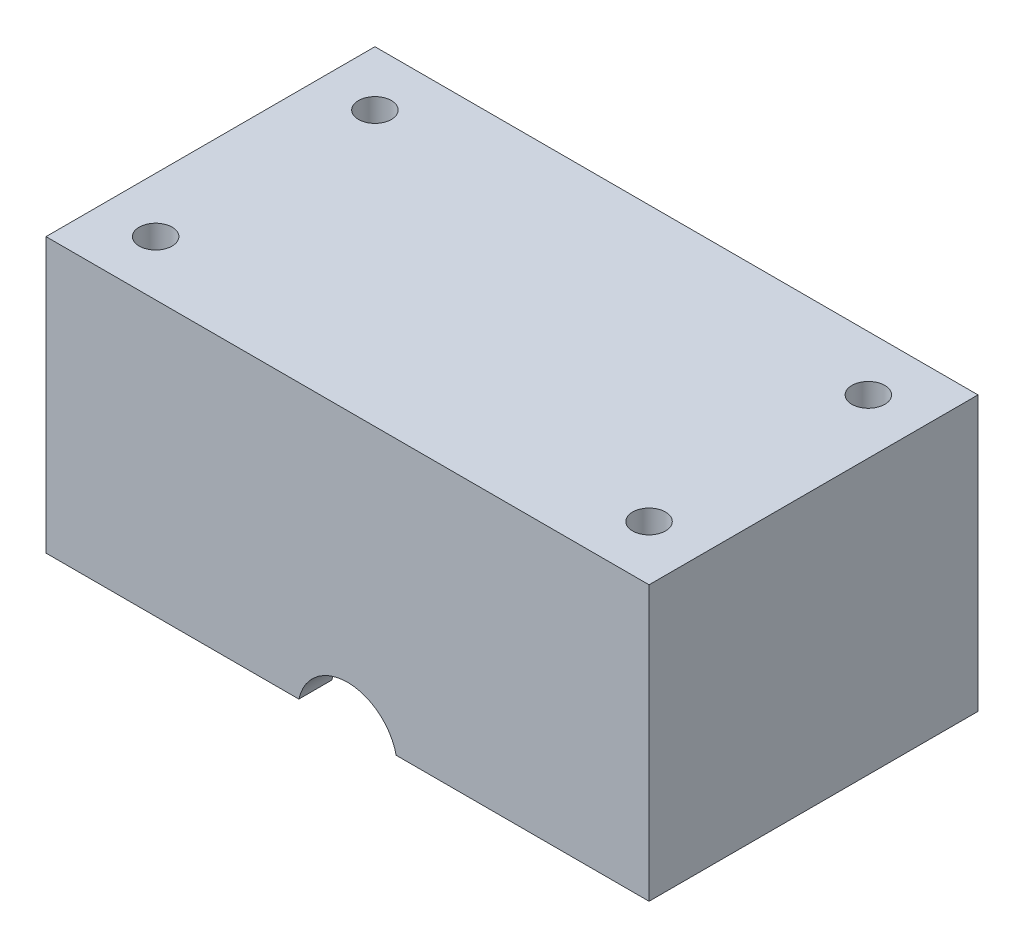
ISO-10303-21;
HEADER;
FILE_DESCRIPTION(('STEP AP214'),'2;1');
FILE_NAME('part.step','',(''),(''),'','','');
FILE_SCHEMA(('AUTOMOTIVE_DESIGN { 1 0 10303 214 1 1 1 1 }'));
ENDSEC;
DATA;
#1=APPLICATION_CONTEXT('core data for automotive mechanical design processes');
#2=APPLICATION_PROTOCOL_DEFINITION('international standard','automotive_design',2000,#1);
#3=PRODUCT_CONTEXT('',#1,'mechanical');
#4=PRODUCT('Part','Part','',(#3));
#5=PRODUCT_RELATED_PRODUCT_CATEGORY('part','',(#4));
#6=PRODUCT_DEFINITION_FORMATION('','',#4);
#7=PRODUCT_DEFINITION_CONTEXT('part definition',#1,'design');
#8=PRODUCT_DEFINITION('design','',#6,#7);
#9=PRODUCT_DEFINITION_SHAPE('','',#8);
#10=(LENGTH_UNIT() NAMED_UNIT(*) SI_UNIT(.MILLI.,.METRE.));
#11=(NAMED_UNIT(*) PLANE_ANGLE_UNIT() SI_UNIT($,.RADIAN.));
#12=(NAMED_UNIT(*) SI_UNIT($,.STERADIAN.) SOLID_ANGLE_UNIT());
#13=UNCERTAINTY_MEASURE_WITH_UNIT(LENGTH_MEASURE(1.E-05),#10,'distance_accuracy_value','');
#14=(GEOMETRIC_REPRESENTATION_CONTEXT(3) GLOBAL_UNCERTAINTY_ASSIGNED_CONTEXT((#13)) GLOBAL_UNIT_ASSIGNED_CONTEXT((#10,
#11,#12)) REPRESENTATION_CONTEXT('',''));
#15=CARTESIAN_POINT('',(0.,0.,0.));
#16=DIRECTION('',(0.,0.,1.));
#17=DIRECTION('',(1.,0.,0.));
#18=AXIS2_PLACEMENT_3D('',#15,#16,#17);
#19=CARTESIAN_POINT('',(0.,0.,10.));
#20=DIRECTION('',(0.,0.,-1.));
#21=DIRECTION('',(-1.,0.,0.));
#22=AXIS2_PLACEMENT_3D('',#19,#20,#21);
#23=CYLINDRICAL_SURFACE('',#22,15.);
#24=CARTESIAN_POINT('',(0.,0.,7.));
#25=DIRECTION('',(0.,0.,1.));
#26=DIRECTION('',(1.,0.,0.));
#27=AXIS2_PLACEMENT_3D('',#24,#25,#26);
#28=CIRCLE('',#27,15.);
#29=CARTESIAN_POINT('',(14.9666295470958,0.999999999999997,7.));
#30=VERTEX_POINT('',#29);
#31=CARTESIAN_POINT('',(-14.9666295470958,0.999999999999997,7.));
#32=VERTEX_POINT('',#31);
#33=EDGE_CURVE('E204',#30,#32,#28,.T.);
#34=ORIENTED_EDGE('',*,*,#33,.T.);
#35=DIRECTION('',(0.,0.,-1.));
#36=VECTOR('',#35,1.);
#37=CARTESIAN_POINT('',(-14.9666295470958,0.999999999999997,10.));
#38=LINE('',#37,#36);
#39=CARTESIAN_POINT('',(-14.9666295470958,0.999999999999997,-3.));
#40=VERTEX_POINT('',#39);
#41=EDGE_CURVE('E289',#32,#40,#38,.T.);
#42=ORIENTED_EDGE('',*,*,#41,.T.);
#43=CARTESIAN_POINT('',(0.,0.,-3.));
#44=DIRECTION('',(0.,0.,1.));
#45=DIRECTION('',(1.,0.,0.));
#46=AXIS2_PLACEMENT_3D('',#43,#44,#45);
#47=CIRCLE('',#46,15.);
#48=CARTESIAN_POINT('',(14.9666295470958,0.999999999999997,-3.));
#49=VERTEX_POINT('',#48);
#50=EDGE_CURVE('E200',#49,#40,#47,.T.);
#51=ORIENTED_EDGE('',*,*,#50,.F.);
#52=DIRECTION('',(0.,0.,-1.));
#53=VECTOR('',#52,1.);
#54=CARTESIAN_POINT('',(14.9666295470958,0.999999999999997,10.));
#55=LINE('',#54,#53);
#56=EDGE_CURVE('E319',#49,#30,#55,.F.);
#57=ORIENTED_EDGE('',*,*,#56,.T.);
#58=EDGE_LOOP('',(#34,#42,#51,#57));
#59=FACE_BOUND('',#58,.T.);
#60=ADVANCED_FACE('F70',(#59),#23,.F.);
#61=CARTESIAN_POINT('',(0.,0.,-20.));
#62=DIRECTION('',(0.,0.,1.));
#63=DIRECTION('',(1.,0.,0.));
#64=AXIS2_PLACEMENT_3D('',#61,#62,#63);
#65=CYLINDRICAL_SURFACE('',#64,15.);
#66=CARTESIAN_POINT('',(0.,0.,-17.));
#67=DIRECTION('',(0.,0.,-1.));
#68=DIRECTION('',(-1.,0.,0.));
#69=AXIS2_PLACEMENT_3D('',#66,#67,#68);
#70=CIRCLE('',#69,15.);
#71=CARTESIAN_POINT('',(-14.9666295470958,0.999999999999997,-17.));
#72=VERTEX_POINT('',#71);
#73=CARTESIAN_POINT('',(14.9666295470958,0.999999999999997,-17.));
#74=VERTEX_POINT('',#73);
#75=EDGE_CURVE('E213',#72,#74,#70,.T.);
#76=ORIENTED_EDGE('',*,*,#75,.T.);
#77=DIRECTION('',(0.,0.,1.));
#78=VECTOR('',#77,1.);
#79=CARTESIAN_POINT('',(14.9666295470958,0.999999999999997,-20.));
#80=LINE('',#79,#78);
#81=CARTESIAN_POINT('',(14.9666295470958,0.999999999999997,-7.));
#82=VERTEX_POINT('',#81);
#83=EDGE_CURVE('E313',#74,#82,#80,.T.);
#84=ORIENTED_EDGE('',*,*,#83,.T.);
#85=CARTESIAN_POINT('',(0.,0.,-7.));
#86=DIRECTION('',(0.,0.,-1.));
#87=DIRECTION('',(-1.,0.,0.));
#88=AXIS2_PLACEMENT_3D('',#85,#86,#87);
#89=CIRCLE('',#88,15.);
#90=CARTESIAN_POINT('',(-14.9666295470958,0.999999999999997,-7.));
#91=VERTEX_POINT('',#90);
#92=EDGE_CURVE('E196',#91,#82,#89,.T.);
#93=ORIENTED_EDGE('',*,*,#92,.F.);
#94=DIRECTION('',(0.,0.,1.));
#95=VECTOR('',#94,1.);
#96=CARTESIAN_POINT('',(-14.9666295470958,0.999999999999997,-20.));
#97=LINE('',#96,#95);
#98=EDGE_CURVE('E305',#91,#72,#97,.F.);
#99=ORIENTED_EDGE('',*,*,#98,.T.);
#100=EDGE_LOOP('',(#76,#84,#93,#99));
#101=FACE_BOUND('',#100,.T.);
#102=ADVANCED_FACE('F348',(#101),#65,.F.);
#103=CARTESIAN_POINT('',(0.,0.,-20.));
#104=DIRECTION('',(0.,0.,1.));
#105=DIRECTION('',(1.,0.,0.));
#106=AXIS2_PLACEMENT_3D('',#103,#104,#105);
#107=CYLINDRICAL_SURFACE('',#106,4.55);
#108=DIRECTION('',(0.,0.,1.));
#109=VECTOR('',#108,1.);
#110=CARTESIAN_POINT('',(4.43874982399324,0.999999999999997,-20.));
#111=LINE('',#110,#109);
#112=CARTESIAN_POINT('',(4.43874982399324,0.999999999999997,-3.));
#113=VERTEX_POINT('',#112);
#114=CARTESIAN_POINT('',(4.43874982399324,0.999999999999997,-7.));
#115=VERTEX_POINT('',#114);
#116=EDGE_CURVE('E317',#113,#115,#111,.F.);
#117=ORIENTED_EDGE('',*,*,#116,.F.);
#118=CARTESIAN_POINT('',(0.,0.,-3.));
#119=DIRECTION('',(0.,0.,1.));
#120=DIRECTION('',(1.,0.,0.));
#121=AXIS2_PLACEMENT_3D('',#118,#119,#120);
#122=CIRCLE('',#121,4.55);
#123=CARTESIAN_POINT('',(-4.43874982399324,0.999999999999997,-3.));
#124=VERTEX_POINT('',#123);
#125=EDGE_CURVE('E197',#124,#113,#122,.F.);
#126=ORIENTED_EDGE('',*,*,#125,.F.);
#127=DIRECTION('',(0.,0.,1.));
#128=VECTOR('',#127,1.);
#129=CARTESIAN_POINT('',(-4.43874982399324,0.999999999999997,-20.));
#130=LINE('',#129,#128);
#131=CARTESIAN_POINT('',(-4.43874982399324,0.999999999999997,-7.));
#132=VERTEX_POINT('',#131);
#133=EDGE_CURVE('E297',#132,#124,#130,.T.);
#134=ORIENTED_EDGE('',*,*,#133,.F.);
#135=CARTESIAN_POINT('',(0.,0.,-7.));
#136=DIRECTION('',(0.,0.,-1.));
#137=DIRECTION('',(-1.,0.,0.));
#138=AXIS2_PLACEMENT_3D('',#135,#136,#137);
#139=CIRCLE('',#138,4.55);
#140=EDGE_CURVE('E191',#115,#132,#139,.F.);
#141=ORIENTED_EDGE('',*,*,#140,.F.);
#142=EDGE_LOOP('',(#117,#126,#134,#141));
#143=FACE_BOUND('',#142,.T.);
#144=ADVANCED_FACE('F354',(#143),#107,.F.);
#145=CARTESIAN_POINT('',(0.,0.,-7.));
#146=DIRECTION('',(0.,0.,-1.));
#147=DIRECTION('',(-1.,0.,0.));
#148=AXIS2_PLACEMENT_3D('',#145,#146,#147);
#149=PLANE('',#148);
#150=ORIENTED_EDGE('',*,*,#92,.T.);
#151=DIRECTION('',(-1.,0.,0.));
#152=VECTOR('',#151,1.);
#153=CARTESIAN_POINT('',(0.,0.999999999999997,-7.));
#154=LINE('',#153,#152);
#155=EDGE_CURVE('E306',#82,#115,#154,.T.);
#156=ORIENTED_EDGE('',*,*,#155,.T.);
#157=ORIENTED_EDGE('',*,*,#140,.T.);
#158=EDGE_CURVE('E301',#132,#91,#154,.T.);
#159=ORIENTED_EDGE('',*,*,#158,.T.);
#160=EDGE_LOOP('',(#150,#156,#157,#159));
#161=FACE_BOUND('',#160,.T.);
#162=ADVANCED_FACE('F391',(#161),#149,.T.);
#163=CARTESIAN_POINT('',(0.,0.,-3.));
#164=DIRECTION('',(0.,0.,1.));
#165=DIRECTION('',(1.,0.,0.));
#166=AXIS2_PLACEMENT_3D('',#163,#164,#165);
#167=PLANE('',#166);
#168=ORIENTED_EDGE('',*,*,#50,.T.);
#169=DIRECTION('',(1.,0.,0.));
#170=VECTOR('',#169,1.);
#171=CARTESIAN_POINT('',(0.,0.999999999999997,-3.));
#172=LINE('',#171,#170);
#173=EDGE_CURVE('E293',#40,#124,#172,.T.);
#174=ORIENTED_EDGE('',*,*,#173,.T.);
#175=ORIENTED_EDGE('',*,*,#125,.T.);
#176=EDGE_CURVE('E298',#113,#49,#172,.T.);
#177=ORIENTED_EDGE('',*,*,#176,.T.);
#178=EDGE_LOOP('',(#168,#174,#175,#177));
#179=FACE_BOUND('',#178,.T.);
#180=ADVANCED_FACE('F329',(#179),#167,.T.);
#181=CARTESIAN_POINT('',(0.,0.,-17.));
#182=DIRECTION('',(0.,0.,-1.));
#183=DIRECTION('',(-1.,0.,0.));
#184=AXIS2_PLACEMENT_3D('',#181,#182,#183);
#185=PLANE('',#184);
#186=DIRECTION('',(-1.,0.,0.));
#187=VECTOR('',#186,1.);
#188=CARTESIAN_POINT('',(0.,0.999999999999997,-17.));
#189=LINE('',#188,#187);
#190=EDGE_CURVE('E310',#74,#72,#189,.T.);
#191=ORIENTED_EDGE('',*,*,#190,.F.);
#192=ORIENTED_EDGE('',*,*,#75,.F.);
#193=EDGE_LOOP('',(#191,#192));
#194=FACE_BOUND('',#193,.T.);
#195=ADVANCED_FACE('F344',(#194),#185,.F.);
#196=CARTESIAN_POINT('',(0.,0.,7.));
#197=DIRECTION('',(0.,0.,1.));
#198=DIRECTION('',(1.,0.,0.));
#199=AXIS2_PLACEMENT_3D('',#196,#197,#198);
#200=PLANE('',#199);
#201=DIRECTION('',(1.,0.,0.));
#202=VECTOR('',#201,1.);
#203=CARTESIAN_POINT('',(0.,0.999999999999997,7.));
#204=LINE('',#203,#202);
#205=CARTESIAN_POINT('',(-4.43874982399324,0.999999999999997,7.));
#206=VERTEX_POINT('',#205);
#207=EDGE_CURVE('E286',#32,#206,#204,.T.);
#208=ORIENTED_EDGE('',*,*,#207,.F.);
#209=ORIENTED_EDGE('',*,*,#33,.F.);
#210=CARTESIAN_POINT('',(4.43874982399324,0.999999999999997,7.));
#211=VERTEX_POINT('',#210);
#212=EDGE_CURVE('E220',#211,#30,#204,.T.);
#213=ORIENTED_EDGE('',*,*,#212,.F.);
#214=CARTESIAN_POINT('',(0.,0.,7.));
#215=DIRECTION('',(0.,0.,1.));
#216=DIRECTION('',(1.,0.,0.));
#217=AXIS2_PLACEMENT_3D('',#214,#215,#216);
#218=CIRCLE('',#217,4.55);
#219=EDGE_CURVE('E201',#211,#206,#218,.T.);
#220=ORIENTED_EDGE('',*,*,#219,.T.);
#221=EDGE_LOOP('',(#208,#209,#213,#220));
#222=FACE_BOUND('',#221,.T.);
#223=ADVANCED_FACE('F332',(#222),#200,.F.);
#224=CARTESIAN_POINT('',(0.,0.,-10.));
#225=DIRECTION('',(0.,0.,1.));
#226=DIRECTION('',(1.,0.,0.));
#227=AXIS2_PLACEMENT_3D('',#224,#225,#226);
#228=CYLINDRICAL_SURFACE('',#227,4.55);
#229=DIRECTION('',(0.,0.,1.));
#230=VECTOR('',#229,1.);
#231=CARTESIAN_POINT('',(4.43874982399324,0.999999999999997,-10.));
#232=LINE('',#231,#230);
#233=CARTESIAN_POINT('',(4.43874982399324,0.999999999999997,10.));
#234=VERTEX_POINT('',#233);
#235=EDGE_CURVE('E215',#234,#211,#232,.F.);
#236=ORIENTED_EDGE('',*,*,#235,.F.);
#237=CARTESIAN_POINT('',(0.,0.,10.));
#238=DIRECTION('',(0.,0.,1.));
#239=DIRECTION('',(1.,0.,0.));
#240=AXIS2_PLACEMENT_3D('',#237,#238,#239);
#241=CIRCLE('',#240,4.55);
#242=CARTESIAN_POINT('',(-4.43874982399324,0.999999999999997,10.));
#243=VERTEX_POINT('',#242);
#244=EDGE_CURVE('E205',#234,#243,#241,.T.);
#245=ORIENTED_EDGE('',*,*,#244,.T.);
#246=DIRECTION('',(0.,0.,1.));
#247=VECTOR('',#246,1.);
#248=CARTESIAN_POINT('',(-4.43874982399324,0.999999999999997,-10.));
#249=LINE('',#248,#247);
#250=EDGE_CURVE('E164',#206,#243,#249,.T.);
#251=ORIENTED_EDGE('',*,*,#250,.F.);
#252=ORIENTED_EDGE('',*,*,#219,.F.);
#253=EDGE_LOOP('',(#236,#245,#251,#252));
#254=FACE_BOUND('',#253,.T.);
#255=ADVANCED_FACE('F333',(#254),#228,.F.);
#256=CARTESIAN_POINT('',(-22.5,-17.5,-15.));
#257=DIRECTION('',(0.,1.,0.));
#258=DIRECTION('',(0.,0.,1.));
#259=AXIS2_PLACEMENT_3D('',#256,#257,#258);
#260=CYLINDRICAL_SURFACE('',#259,1.5);
#261=CARTESIAN_POINT('',(-22.5,26.,-15.));
#262=DIRECTION('',(0.,1.,0.));
#263=DIRECTION('',(0.,0.,1.));
#264=AXIS2_PLACEMENT_3D('',#261,#262,#263);
#265=CIRCLE('',#264,1.5);
#266=CARTESIAN_POINT('',(-22.5,26.,-13.5));
#267=VERTEX_POINT('',#266);
#268=EDGE_CURVE('E241',#267,#267,#265,.T.);
#269=ORIENTED_EDGE('',*,*,#268,.T.);
#270=EDGE_LOOP('',(#269));
#271=FACE_BOUND('',#270,.T.);
#272=CARTESIAN_POINT('',(-22.5,0.999999999999997,-15.));
#273=DIRECTION('',(0.,-1.,0.));
#274=DIRECTION('',(0.,0.,-1.));
#275=AXIS2_PLACEMENT_3D('',#272,#273,#274);
#276=CIRCLE('',#275,1.5);
#277=CARTESIAN_POINT('',(-22.5,0.999999999999997,-16.5));
#278=VERTEX_POINT('',#277);
#279=EDGE_CURVE('E280',#278,#278,#276,.F.);
#280=ORIENTED_EDGE('',*,*,#279,.F.);
#281=EDGE_LOOP('',(#280));
#282=FACE_BOUND('',#281,.T.);
#283=ADVANCED_FACE('F335',(#271,#282),#260,.F.);
#284=CARTESIAN_POINT('',(-22.5,-17.5,5.));
#285=DIRECTION('',(0.,1.,0.));
#286=DIRECTION('',(0.,0.,1.));
#287=AXIS2_PLACEMENT_3D('',#284,#285,#286);
#288=CYLINDRICAL_SURFACE('',#287,1.5);
#289=CARTESIAN_POINT('',(-22.5,26.,5.));
#290=DIRECTION('',(0.,1.,0.));
#291=DIRECTION('',(0.,0.,1.));
#292=AXIS2_PLACEMENT_3D('',#289,#290,#291);
#293=CIRCLE('',#292,1.5);
#294=CARTESIAN_POINT('',(-22.5,26.,6.5));
#295=VERTEX_POINT('',#294);
#296=EDGE_CURVE('E237',#295,#295,#293,.T.);
#297=ORIENTED_EDGE('',*,*,#296,.T.);
#298=EDGE_LOOP('',(#297));
#299=FACE_BOUND('',#298,.T.);
#300=CARTESIAN_POINT('',(-22.5,0.999999999999997,5.));
#301=DIRECTION('',(0.,-1.,0.));
#302=DIRECTION('',(0.,0.,-1.));
#303=AXIS2_PLACEMENT_3D('',#300,#301,#302);
#304=CIRCLE('',#303,1.5);
#305=CARTESIAN_POINT('',(-22.5,0.999999999999997,3.5));
#306=VERTEX_POINT('',#305);
#307=EDGE_CURVE('E276',#306,#306,#304,.F.);
#308=ORIENTED_EDGE('',*,*,#307,.F.);
#309=EDGE_LOOP('',(#308));
#310=FACE_BOUND('',#309,.T.);
#311=ADVANCED_FACE('F341',(#299,#310),#288,.F.);
#312=CARTESIAN_POINT('',(22.5,-17.5,5.));
#313=DIRECTION('',(0.,1.,0.));
#314=DIRECTION('',(0.,0.,1.));
#315=AXIS2_PLACEMENT_3D('',#312,#313,#314);
#316=CYLINDRICAL_SURFACE('',#315,1.5);
#317=CARTESIAN_POINT('',(22.5,26.,5.));
#318=DIRECTION('',(0.,1.,0.));
#319=DIRECTION('',(0.,0.,1.));
#320=AXIS2_PLACEMENT_3D('',#317,#318,#319);
#321=CIRCLE('',#320,1.5);
#322=CARTESIAN_POINT('',(22.5,26.,6.5));
#323=VERTEX_POINT('',#322);
#324=EDGE_CURVE('E195',#323,#323,#321,.T.);
#325=ORIENTED_EDGE('',*,*,#324,.T.);
#326=EDGE_LOOP('',(#325));
#327=FACE_BOUND('',#326,.T.);
#328=CARTESIAN_POINT('',(22.5,0.999999999999997,5.));
#329=DIRECTION('',(0.,-1.,0.));
#330=DIRECTION('',(0.,0.,-1.));
#331=AXIS2_PLACEMENT_3D('',#328,#329,#330);
#332=CIRCLE('',#331,1.5);
#333=CARTESIAN_POINT('',(22.5,0.999999999999997,3.5));
#334=VERTEX_POINT('',#333);
#335=EDGE_CURVE('E272',#334,#334,#332,.F.);
#336=ORIENTED_EDGE('',*,*,#335,.F.);
#337=EDGE_LOOP('',(#336));
#338=FACE_BOUND('',#337,.T.);
#339=ADVANCED_FACE('F386',(#327,#338),#316,.F.);
#340=CARTESIAN_POINT('',(22.5,-17.5,-15.));
#341=DIRECTION('',(0.,1.,0.));
#342=DIRECTION('',(0.,0.,1.));
#343=AXIS2_PLACEMENT_3D('',#340,#341,#342);
#344=CYLINDRICAL_SURFACE('',#343,1.5);
#345=CARTESIAN_POINT('',(22.5,26.,-15.));
#346=DIRECTION('',(0.,1.,0.));
#347=DIRECTION('',(0.,0.,1.));
#348=AXIS2_PLACEMENT_3D('',#345,#346,#347);
#349=CIRCLE('',#348,1.5);
#350=CARTESIAN_POINT('',(22.5,26.,-13.5));
#351=VERTEX_POINT('',#350);
#352=EDGE_CURVE('E236',#351,#351,#349,.T.);
#353=ORIENTED_EDGE('',*,*,#352,.T.);
#354=EDGE_LOOP('',(#353));
#355=FACE_BOUND('',#354,.T.);
#356=CARTESIAN_POINT('',(22.5,0.999999999999997,-15.));
#357=DIRECTION('',(0.,-1.,0.));
#358=DIRECTION('',(0.,0.,-1.));
#359=AXIS2_PLACEMENT_3D('',#356,#357,#358);
#360=CIRCLE('',#359,1.5);
#361=CARTESIAN_POINT('',(22.5,0.999999999999997,-16.5));
#362=VERTEX_POINT('',#361);
#363=EDGE_CURVE('E268',#362,#362,#360,.F.);
#364=ORIENTED_EDGE('',*,*,#363,.F.);
#365=EDGE_LOOP('',(#364));
#366=FACE_BOUND('',#365,.T.);
#367=ADVANCED_FACE('F381',(#355,#366),#344,.F.);
#368=CARTESIAN_POINT('',(0.,0.,-20.));
#369=DIRECTION('',(0.,0.,-1.));
#370=DIRECTION('',(-1.,0.,0.));
#371=AXIS2_PLACEMENT_3D('',#368,#369,#370);
#372=PLANE('',#371);
#373=DIRECTION('',(0.,-1.,0.));
#374=VECTOR('',#373,1.);
#375=CARTESIAN_POINT('',(27.5,26.,-20.));
#376=LINE('',#375,#374);
#377=CARTESIAN_POINT('',(27.5,26.,-20.));
#378=VERTEX_POINT('',#377);
#379=CARTESIAN_POINT('',(27.5,0.999999999999997,-20.));
#380=VERTEX_POINT('',#379);
#381=EDGE_CURVE('E254',#378,#380,#376,.T.);
#382=ORIENTED_EDGE('',*,*,#381,.T.);
#383=DIRECTION('',(1.,0.,0.));
#384=VECTOR('',#383,1.);
#385=CARTESIAN_POINT('',(-27.5,0.999999999999997,-20.));
#386=LINE('',#385,#384);
#387=CARTESIAN_POINT('',(-27.5,0.999999999999997,-20.));
#388=VERTEX_POINT('',#387);
#389=EDGE_CURVE('E175',#388,#380,#386,.T.);
#390=ORIENTED_EDGE('',*,*,#389,.F.);
#391=DIRECTION('',(0.,1.,0.));
#392=VECTOR('',#391,1.);
#393=CARTESIAN_POINT('',(-27.5,21.,-20.));
#394=LINE('',#393,#392);
#395=CARTESIAN_POINT('',(-27.5,26.,-20.));
#396=VERTEX_POINT('',#395);
#397=EDGE_CURVE('E173',#388,#396,#394,.T.);
#398=ORIENTED_EDGE('',*,*,#397,.T.);
#399=DIRECTION('',(1.,0.,0.));
#400=VECTOR('',#399,1.);
#401=CARTESIAN_POINT('',(-27.5,26.,-20.));
#402=LINE('',#401,#400);
#403=EDGE_CURVE('E250',#396,#378,#402,.T.);
#404=ORIENTED_EDGE('',*,*,#403,.T.);
#405=EDGE_LOOP('',(#382,#390,#398,#404));
#406=FACE_BOUND('',#405,.T.);
#407=ADVANCED_FACE('F379',(#406),#372,.T.);
#408=CARTESIAN_POINT('',(27.5,0.,10.));
#409=DIRECTION('',(1.,0.,0.));
#410=DIRECTION('',(0.,0.,-1.));
#411=AXIS2_PLACEMENT_3D('',#408,#409,#410);
#412=PLANE('',#411);
#413=DIRECTION('',(0.,-1.,0.));
#414=VECTOR('',#413,1.);
#415=CARTESIAN_POINT('',(27.5,0.,10.));
#416=LINE('',#415,#414);
#417=CARTESIAN_POINT('',(27.5,26.,10.));
#418=VERTEX_POINT('',#417);
#419=CARTESIAN_POINT('',(27.5,0.999999999999997,10.));
#420=VERTEX_POINT('',#419);
#421=EDGE_CURVE('E185',#418,#420,#416,.T.);
#422=ORIENTED_EDGE('',*,*,#421,.T.);
#423=DIRECTION('',(0.,0.,1.));
#424=VECTOR('',#423,1.);
#425=CARTESIAN_POINT('',(27.5,0.999999999999997,-20.));
#426=LINE('',#425,#424);
#427=EDGE_CURVE('E86',#380,#420,#426,.T.);
#428=ORIENTED_EDGE('',*,*,#427,.F.);
#429=ORIENTED_EDGE('',*,*,#381,.F.);
#430=DIRECTION('',(0.,0.,-1.));
#431=VECTOR('',#430,1.);
#432=CARTESIAN_POINT('',(27.5,26.,10.));
#433=LINE('',#432,#431);
#434=EDGE_CURVE('E79',#418,#378,#433,.T.);
#435=ORIENTED_EDGE('',*,*,#434,.F.);
#436=EDGE_LOOP('',(#422,#428,#429,#435));
#437=FACE_BOUND('',#436,.T.);
#438=ADVANCED_FACE('F72',(#437),#412,.T.);
#439=CARTESIAN_POINT('',(-27.5,0.,10.));
#440=DIRECTION('',(1.,0.,0.));
#441=DIRECTION('',(0.,0.,-1.));
#442=AXIS2_PLACEMENT_3D('',#439,#440,#441);
#443=PLANE('',#442);
#444=DIRECTION('',(0.,0.,-1.));
#445=VECTOR('',#444,1.);
#446=CARTESIAN_POINT('',(-27.5,0.999999999999997,10.));
#447=LINE('',#446,#445);
#448=CARTESIAN_POINT('',(-27.5,0.999999999999997,10.));
#449=VERTEX_POINT('',#448);
#450=EDGE_CURVE('E161',#449,#388,#447,.T.);
#451=ORIENTED_EDGE('',*,*,#450,.F.);
#452=DIRECTION('',(0.,-1.,0.));
#453=VECTOR('',#452,1.);
#454=CARTESIAN_POINT('',(-27.5,0.,10.));
#455=LINE('',#454,#453);
#456=CARTESIAN_POINT('',(-27.5,26.,10.));
#457=VERTEX_POINT('',#456);
#458=EDGE_CURVE('E172',#457,#449,#455,.T.);
#459=ORIENTED_EDGE('',*,*,#458,.F.);
#460=DIRECTION('',(0.,0.,-1.));
#461=VECTOR('',#460,1.);
#462=CARTESIAN_POINT('',(-27.5,26.,10.));
#463=LINE('',#462,#461);
#464=EDGE_CURVE('E180',#457,#396,#463,.T.);
#465=ORIENTED_EDGE('',*,*,#464,.T.);
#466=ORIENTED_EDGE('',*,*,#397,.F.);
#467=EDGE_LOOP('',(#451,#459,#465,#466));
#468=FACE_BOUND('',#467,.T.);
#469=ADVANCED_FACE('F170',(#468),#443,.F.);
#470=CARTESIAN_POINT('',(0.,0.,10.));
#471=DIRECTION('',(0.,0.,1.));
#472=DIRECTION('',(1.,0.,0.));
#473=AXIS2_PLACEMENT_3D('',#470,#471,#472);
#474=PLANE('',#473);
#475=ORIENTED_EDGE('',*,*,#458,.T.);
#476=DIRECTION('',(1.,0.,0.));
#477=VECTOR('',#476,1.);
#478=CARTESIAN_POINT('',(0.,0.999999999999997,10.));
#479=LINE('',#478,#477);
#480=EDGE_CURVE('E12',#449,#243,#479,.T.);
#481=ORIENTED_EDGE('',*,*,#480,.T.);
#482=ORIENTED_EDGE('',*,*,#244,.F.);
#483=DIRECTION('',(-1.,0.,0.));
#484=VECTOR('',#483,1.);
#485=CARTESIAN_POINT('',(27.5,0.999999999999997,10.));
#486=LINE('',#485,#484);
#487=EDGE_CURVE('E176',#420,#234,#486,.T.);
#488=ORIENTED_EDGE('',*,*,#487,.F.);
#489=ORIENTED_EDGE('',*,*,#421,.F.);
#490=DIRECTION('',(-1.,0.,0.));
#491=VECTOR('',#490,1.);
#492=CARTESIAN_POINT('',(0.,26.,10.));
#493=LINE('',#492,#491);
#494=EDGE_CURVE('E94',#418,#457,#493,.T.);
#495=ORIENTED_EDGE('',*,*,#494,.T.);
#496=EDGE_LOOP('',(#475,#481,#482,#488,#489,#495));
#497=FACE_BOUND('',#496,.T.);
#498=ADVANCED_FACE('F178',(#497),#474,.T.);
#499=CARTESIAN_POINT('',(0.,26.,10.));
#500=DIRECTION('',(0.,-1.,0.));
#501=DIRECTION('',(0.,0.,-1.));
#502=AXIS2_PLACEMENT_3D('',#499,#500,#501);
#503=PLANE('',#502);
#504=ORIENTED_EDGE('',*,*,#296,.F.);
#505=EDGE_LOOP('',(#504));
#506=FACE_BOUND('',#505,.T.);
#507=ORIENTED_EDGE('',*,*,#352,.F.);
#508=EDGE_LOOP('',(#507));
#509=FACE_BOUND('',#508,.T.);
#510=ORIENTED_EDGE('',*,*,#324,.F.);
#511=EDGE_LOOP('',(#510));
#512=FACE_BOUND('',#511,.T.);
#513=ORIENTED_EDGE('',*,*,#268,.F.);
#514=EDGE_LOOP('',(#513));
#515=FACE_BOUND('',#514,.T.);
#516=ORIENTED_EDGE('',*,*,#434,.T.);
#517=ORIENTED_EDGE('',*,*,#403,.F.);
#518=ORIENTED_EDGE('',*,*,#464,.F.);
#519=ORIENTED_EDGE('',*,*,#494,.F.);
#520=EDGE_LOOP('',(#516,#517,#518,#519));
#521=FACE_BOUND('',#520,.T.);
#522=ADVANCED_FACE('F361',(#506,#509,#512,#515,#521),#503,.F.);
#523=CARTESIAN_POINT('',(0.,0.999999999999997,0.));
#524=DIRECTION('',(0.,-1.,0.));
#525=DIRECTION('',(0.,0.,-1.));
#526=AXIS2_PLACEMENT_3D('',#523,#524,#525);
#527=PLANE('',#526);
#528=ORIENTED_EDGE('',*,*,#279,.T.);
#529=EDGE_LOOP('',(#528));
#530=FACE_BOUND('',#529,.T.);
#531=ORIENTED_EDGE('',*,*,#307,.T.);
#532=EDGE_LOOP('',(#531));
#533=FACE_BOUND('',#532,.T.);
#534=ORIENTED_EDGE('',*,*,#335,.T.);
#535=EDGE_LOOP('',(#534));
#536=FACE_BOUND('',#535,.T.);
#537=ORIENTED_EDGE('',*,*,#363,.T.);
#538=EDGE_LOOP('',(#537));
#539=FACE_BOUND('',#538,.T.);
#540=ORIENTED_EDGE('',*,*,#235,.T.);
#541=ORIENTED_EDGE('',*,*,#212,.T.);
#542=ORIENTED_EDGE('',*,*,#56,.F.);
#543=ORIENTED_EDGE('',*,*,#176,.F.);
#544=ORIENTED_EDGE('',*,*,#116,.T.);
#545=ORIENTED_EDGE('',*,*,#155,.F.);
#546=ORIENTED_EDGE('',*,*,#83,.F.);
#547=ORIENTED_EDGE('',*,*,#190,.T.);
#548=ORIENTED_EDGE('',*,*,#98,.F.);
#549=ORIENTED_EDGE('',*,*,#158,.F.);
#550=ORIENTED_EDGE('',*,*,#133,.T.);
#551=ORIENTED_EDGE('',*,*,#173,.F.);
#552=ORIENTED_EDGE('',*,*,#41,.F.);
#553=ORIENTED_EDGE('',*,*,#207,.T.);
#554=ORIENTED_EDGE('',*,*,#250,.T.);
#555=ORIENTED_EDGE('',*,*,#480,.F.);
#556=ORIENTED_EDGE('',*,*,#450,.T.);
#557=ORIENTED_EDGE('',*,*,#389,.T.);
#558=ORIENTED_EDGE('',*,*,#427,.T.);
#559=ORIENTED_EDGE('',*,*,#487,.T.);
#560=EDGE_LOOP('',(#540,#541,#542,#543,#544,#545,#546,#547,#548,#549,#550,#551,#552,#553,#554,
#555,#556,#557,#558,#559));
#561=FACE_BOUND('',#560,.T.);
#562=ADVANCED_FACE('F160',(#530,#533,#536,#539,#561),#527,.T.);
#563=CLOSED_SHELL('',(#60,#102,#144,#162,#180,#195,#223,#255,#283,#311,#339,#367,#407,#438,#469,
#498,#522,#562));
#564=MANIFOLD_SOLID_BREP('B2',#563);
#565=ADVANCED_BREP_SHAPE_REPRESENTATION('',(#18,#564),#14);
#566=SHAPE_DEFINITION_REPRESENTATION(#9,#565);
ENDSEC;
END-ISO-10303-21;
